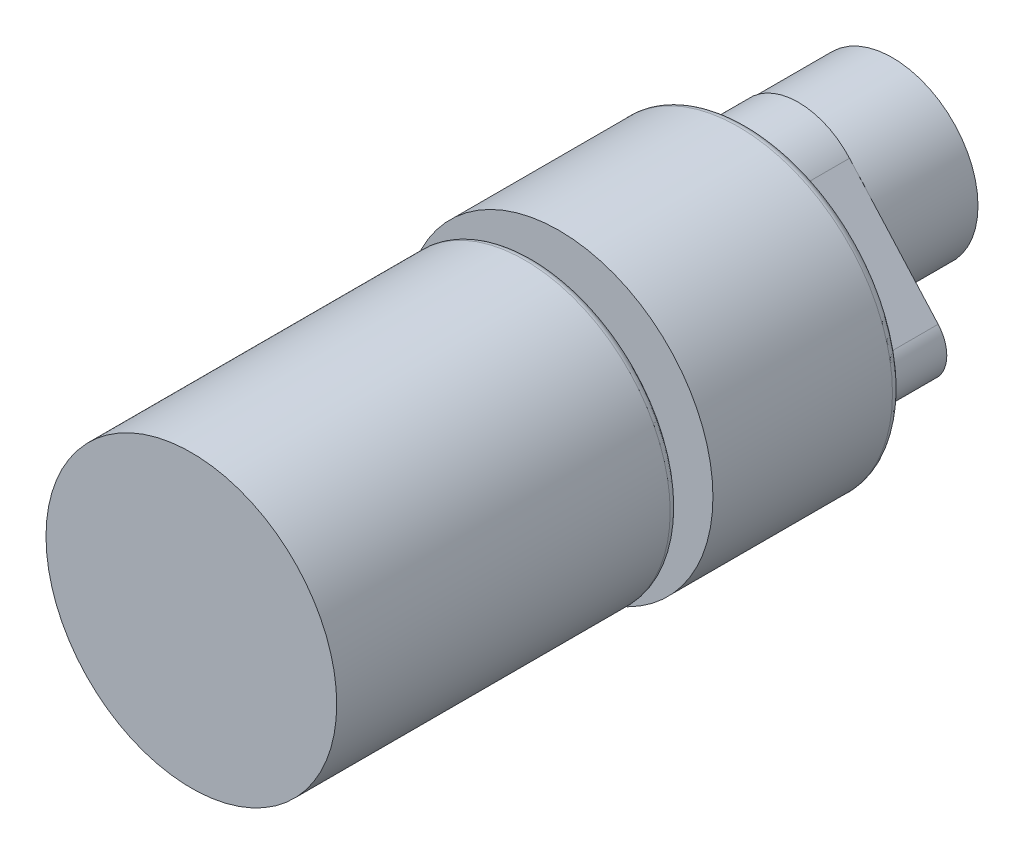
ISO-10303-21;
HEADER;
FILE_DESCRIPTION(('STEP AP214'),'2;1');
FILE_NAME('part.step','',(''),(''),'','','');
FILE_SCHEMA(('AUTOMOTIVE_DESIGN { 1 0 10303 214 1 1 1 1 }'));
ENDSEC;
DATA;
#1=APPLICATION_CONTEXT('core data for automotive mechanical design processes');
#2=APPLICATION_PROTOCOL_DEFINITION('international standard','automotive_design',2000,#1);
#3=PRODUCT_CONTEXT('',#1,'mechanical');
#4=PRODUCT('Part','Part','',(#3));
#5=PRODUCT_RELATED_PRODUCT_CATEGORY('part','',(#4));
#6=PRODUCT_DEFINITION_FORMATION('','',#4);
#7=PRODUCT_DEFINITION_CONTEXT('part definition',#1,'design');
#8=PRODUCT_DEFINITION('design','',#6,#7);
#9=PRODUCT_DEFINITION_SHAPE('','',#8);
#10=(LENGTH_UNIT() NAMED_UNIT(*) SI_UNIT(.MILLI.,.METRE.));
#11=(NAMED_UNIT(*) PLANE_ANGLE_UNIT() SI_UNIT($,.RADIAN.));
#12=(NAMED_UNIT(*) SI_UNIT($,.STERADIAN.) SOLID_ANGLE_UNIT());
#13=UNCERTAINTY_MEASURE_WITH_UNIT(LENGTH_MEASURE(1.E-05),#10,'distance_accuracy_value','');
#14=(GEOMETRIC_REPRESENTATION_CONTEXT(3) GLOBAL_UNCERTAINTY_ASSIGNED_CONTEXT((#13)) GLOBAL_UNIT_ASSIGNED_CONTEXT((#10,
#11,#12)) REPRESENTATION_CONTEXT('',''));
#15=CARTESIAN_POINT('',(0.,0.,0.));
#16=DIRECTION('',(0.,0.,1.));
#17=DIRECTION('',(1.,0.,0.));
#18=AXIS2_PLACEMENT_3D('',#15,#16,#17);
#19=CARTESIAN_POINT('',(0.,8.97293725574376,-71.));
#20=DIRECTION('',(0.,0.,-1.));
#21=DIRECTION('',(1.,0.,0.));
#22=AXIS2_PLACEMENT_3D('',#19,#20,#21);
#23=PLANE('',#22);
#24=CARTESIAN_POINT('',(0.,6.,-71.));
#25=DIRECTION('',(0.,0.,1.));
#26=DIRECTION('',(1.,0.,0.));
#27=AXIS2_PLACEMENT_3D('',#24,#25,#26);
#28=CIRCLE('',#27,10.);
#29=CARTESIAN_POINT('',(7.0041768547025,13.1373318956071,-71.));
#30=VERTEX_POINT('',#29);
#31=CARTESIAN_POINT('',(-7.0041768547025,13.1373318956071,-71.));
#32=VERTEX_POINT('',#31);
#33=EDGE_CURVE('E11',#30,#32,#28,.T.);
#34=ORIENTED_EDGE('',*,*,#33,.T.);
#35=DIRECTION('',(-0.665166563949336,-0.746695012842481,0.));
#36=VECTOR('',#35,1.);
#37=CARTESIAN_POINT('',(-5.97356010273985,14.2942697673385,-71.));
#38=LINE('',#37,#36);
#39=CARTESIAN_POINT('',(-5.97356010273985,14.2942697673385,-71.));
#40=VERTEX_POINT('',#39);
#41=EDGE_CURVE('E152',#40,#32,#38,.T.);
#42=ORIENTED_EDGE('',*,*,#41,.F.);
#43=CARTESIAN_POINT('',(0.,8.97293725574376,-71.));
#44=DIRECTION('',(0.,0.,1.));
#45=DIRECTION('',(1.,0.,0.));
#46=AXIS2_PLACEMENT_3D('',#43,#44,#45);
#47=CIRCLE('',#46,8.);
#48=CARTESIAN_POINT('',(5.97356010273985,14.2942697673385,-71.));
#49=VERTEX_POINT('',#48);
#50=EDGE_CURVE('E157',#49,#40,#47,.T.);
#51=ORIENTED_EDGE('',*,*,#50,.F.);
#52=DIRECTION('',(-0.665166563949337,0.746695012842481,0.));
#53=VECTOR('',#52,1.);
#54=CARTESIAN_POINT('',(16.3369399847924,2.66066625579735,-71.));
#55=LINE('',#54,#53);
#56=EDGE_CURVE('E132',#30,#49,#55,.T.);
#57=ORIENTED_EDGE('',*,*,#56,.F.);
#58=EDGE_LOOP('',(#34,#42,#51,#57));
#59=FACE_BOUND('',#58,.T.);
#60=ADVANCED_FACE('F35',(#59),#23,.T.);
#61=CARTESIAN_POINT('',(-7.89611982561368,12.1360648382779,-71.));
#62=VERTEX_POINT('',#61);
#63=CARTESIAN_POINT('',(0.,-4.,-71.));
#64=VERTEX_POINT('',#63);
#65=EDGE_CURVE('E44',#62,#64,#28,.T.);
#66=ORIENTED_EDGE('',*,*,#65,.T.);
#67=DIRECTION('',(1.,0.,0.));
#68=VECTOR('',#67,1.);
#69=CARTESIAN_POINT('',(-13.3501599334225,-4.,-71.));
#70=LINE('',#69,#68);
#71=CARTESIAN_POINT('',(-13.3501599334225,-4.,-71.));
#72=VERTEX_POINT('',#71);
#73=EDGE_CURVE('E144',#72,#64,#70,.T.);
#74=ORIENTED_EDGE('',*,*,#73,.F.);
#75=CARTESIAN_POINT('',(-13.3501599334225,0.,-71.));
#76=DIRECTION('',(0.,0.,1.));
#77=DIRECTION('',(-1.,0.,0.));
#78=AXIS2_PLACEMENT_3D('',#75,#76,#77);
#79=CIRCLE('',#78,4.);
#80=CARTESIAN_POINT('',(-16.3369399847924,2.66066625579734,-71.));
#81=VERTEX_POINT('',#80);
#82=EDGE_CURVE('E149',#81,#72,#79,.T.);
#83=ORIENTED_EDGE('',*,*,#82,.F.);
#84=EDGE_CURVE('E156',#62,#81,#38,.T.);
#85=ORIENTED_EDGE('',*,*,#84,.F.);
#86=EDGE_LOOP('',(#66,#74,#83,#85));
#87=FACE_BOUND('',#86,.T.);
#88=ADVANCED_FACE('F249',(#87),#23,.T.);
#89=CARTESIAN_POINT('',(0.,0.,-65.));
#90=DIRECTION('',(0.,0.,-1.));
#91=DIRECTION('',(1.,0.,0.));
#92=AXIS2_PLACEMENT_3D('',#89,#90,#91);
#93=PLANE('',#92);
#94=DIRECTION('',(1.,0.,0.));
#95=VECTOR('',#94,1.);
#96=CARTESIAN_POINT('',(-13.3501599334225,-4.,-65.));
#97=LINE('',#96,#95);
#98=CARTESIAN_POINT('',(-13.3501599334225,-4.,-65.));
#99=VERTEX_POINT('',#98);
#100=CARTESIAN_POINT('',(13.3501599334225,-4.,-65.));
#101=VERTEX_POINT('',#100);
#102=EDGE_CURVE('E177',#99,#101,#97,.T.);
#103=ORIENTED_EDGE('',*,*,#102,.T.);
#104=CARTESIAN_POINT('',(13.3501599334225,0.,-65.));
#105=DIRECTION('',(0.,0.,1.));
#106=DIRECTION('',(1.,0.,0.));
#107=AXIS2_PLACEMENT_3D('',#104,#105,#106);
#108=CIRCLE('',#107,4.);
#109=CARTESIAN_POINT('',(16.8996765768439,-1.84416148915284,-65.));
#110=VERTEX_POINT('',#109);
#111=EDGE_CURVE('E182',#101,#110,#108,.T.);
#112=ORIENTED_EDGE('',*,*,#111,.T.);
#113=CARTESIAN_POINT('',(0.,0.,-65.));
#114=DIRECTION('',(0.,0.,1.));
#115=DIRECTION('',(1.,0.,0.));
#116=AXIS2_PLACEMENT_3D('',#113,#114,#115);
#117=CIRCLE('',#116,17.);
#118=CARTESIAN_POINT('',(-16.8996765768439,-1.84416148915284,-65.));
#119=VERTEX_POINT('',#118);
#120=EDGE_CURVE('E222',#119,#110,#117,.T.);
#121=ORIENTED_EDGE('',*,*,#120,.F.);
#122=CARTESIAN_POINT('',(-13.3501599334225,0.,-65.));
#123=DIRECTION('',(0.,0.,1.));
#124=DIRECTION('',(-1.,0.,0.));
#125=AXIS2_PLACEMENT_3D('',#122,#123,#124);
#126=CIRCLE('',#125,4.);
#127=EDGE_CURVE('E171',#119,#99,#126,.T.);
#128=ORIENTED_EDGE('',*,*,#127,.T.);
#129=EDGE_LOOP('',(#103,#112,#121,#128));
#130=FACE_BOUND('',#129,.T.);
#131=ADVANCED_FACE('F232',(#130),#93,.T.);
#132=CARTESIAN_POINT('',(16.8996765768439,1.84416148915285,-65.));
#133=VERTEX_POINT('',#132);
#134=CARTESIAN_POINT('',(-16.8996765768439,1.84416148915284,-65.));
#135=VERTEX_POINT('',#134);
#136=EDGE_CURVE('E214',#133,#135,#117,.T.);
#137=ORIENTED_EDGE('',*,*,#136,.F.);
#138=CARTESIAN_POINT('',(16.3369399847924,2.66066625579735,-65.));
#139=VERTEX_POINT('',#138);
#140=EDGE_CURVE('E181',#133,#139,#108,.T.);
#141=ORIENTED_EDGE('',*,*,#140,.T.);
#142=DIRECTION('',(-0.665166563949337,0.746695012842481,0.));
#143=VECTOR('',#142,1.);
#144=CARTESIAN_POINT('',(16.3369399847924,2.66066625579735,-65.));
#145=LINE('',#144,#143);
#146=CARTESIAN_POINT('',(5.97356010273985,14.2942697673385,-65.));
#147=VERTEX_POINT('',#146);
#148=EDGE_CURVE('E159',#139,#147,#145,.T.);
#149=ORIENTED_EDGE('',*,*,#148,.T.);
#150=CARTESIAN_POINT('',(0.,8.97293725574376,-65.));
#151=DIRECTION('',(0.,0.,1.));
#152=DIRECTION('',(1.,0.,0.));
#153=AXIS2_PLACEMENT_3D('',#150,#151,#152);
#154=CIRCLE('',#153,8.);
#155=CARTESIAN_POINT('',(-5.97356010273985,14.2942697673385,-65.));
#156=VERTEX_POINT('',#155);
#157=EDGE_CURVE('E162',#147,#156,#154,.T.);
#158=ORIENTED_EDGE('',*,*,#157,.T.);
#159=DIRECTION('',(-0.665166563949336,-0.746695012842481,0.));
#160=VECTOR('',#159,1.);
#161=CARTESIAN_POINT('',(-5.97356010273985,14.2942697673385,-65.));
#162=LINE('',#161,#160);
#163=CARTESIAN_POINT('',(-16.3369399847924,2.66066625579734,-65.));
#164=VERTEX_POINT('',#163);
#165=EDGE_CURVE('E166',#156,#164,#162,.T.);
#166=ORIENTED_EDGE('',*,*,#165,.T.);
#167=EDGE_CURVE('E174',#164,#135,#126,.T.);
#168=ORIENTED_EDGE('',*,*,#167,.T.);
#169=EDGE_LOOP('',(#137,#141,#149,#158,#166,#168));
#170=FACE_BOUND('',#169,.T.);
#171=ADVANCED_FACE('F428',(#170),#93,.T.);
#172=CARTESIAN_POINT('',(0.,0.,-40.));
#173=DIRECTION('',(0.,0.,1.));
#174=DIRECTION('',(-1.,0.,0.));
#175=AXIS2_PLACEMENT_3D('',#172,#173,#174);
#176=CYLINDRICAL_SURFACE('',#175,17.);
#177=CARTESIAN_POINT('',(0.,0.,-39.));
#178=DIRECTION('',(0.,0.,1.));
#179=DIRECTION('',(1.,0.,0.));
#180=AXIS2_PLACEMENT_3D('',#177,#178,#179);
#181=CIRCLE('',#180,17.);
#182=CARTESIAN_POINT('',(17.,0.,-39.));
#183=VERTEX_POINT('',#182);
#184=EDGE_CURVE('E211',#183,#183,#181,.F.);
#185=ORIENTED_EDGE('',*,*,#184,.F.);
#186=EDGE_LOOP('',(#185));
#187=FACE_BOUND('',#186,.T.);
#188=CARTESIAN_POINT('',(0.,0.,0.));
#189=DIRECTION('',(0.,0.,1.));
#190=DIRECTION('',(1.,0.,0.));
#191=AXIS2_PLACEMENT_3D('',#188,#189,#190);
#192=CIRCLE('',#191,17.);
#193=CARTESIAN_POINT('',(17.,0.,0.));
#194=VERTEX_POINT('',#193);
#195=EDGE_CURVE('E203',#194,#194,#192,.T.);
#196=ORIENTED_EDGE('',*,*,#195,.F.);
#197=EDGE_LOOP('',(#196));
#198=FACE_BOUND('',#197,.T.);
#199=ADVANCED_FACE('F418',(#187,#198),#176,.T.);
#200=CARTESIAN_POINT('',(0.,0.,-40.));
#201=DIRECTION('',(0.,0.,-1.));
#202=DIRECTION('',(1.,0.,0.));
#203=AXIS2_PLACEMENT_3D('',#200,#201,#202);
#204=PLANE('',#203);
#205=CARTESIAN_POINT('',(0.,0.,-40.));
#206=DIRECTION('',(0.,0.,1.));
#207=DIRECTION('',(1.,0.,0.));
#208=AXIS2_PLACEMENT_3D('',#205,#206,#207);
#209=CIRCLE('',#208,16.);
#210=CARTESIAN_POINT('',(16.,0.,-40.));
#211=VERTEX_POINT('',#210);
#212=EDGE_CURVE('E208',#211,#211,#209,.T.);
#213=ORIENTED_EDGE('',*,*,#212,.F.);
#214=EDGE_LOOP('',(#213));
#215=FACE_BOUND('',#214,.T.);
#216=CARTESIAN_POINT('',(0.,0.,-40.));
#217=DIRECTION('',(0.,0.,1.));
#218=DIRECTION('',(1.,0.,0.));
#219=AXIS2_PLACEMENT_3D('',#216,#217,#218);
#220=CIRCLE('',#219,5.);
#221=CARTESIAN_POINT('',(5.,0.,-40.));
#222=VERTEX_POINT('',#221);
#223=EDGE_CURVE('E199',#222,#222,#220,.T.);
#224=ORIENTED_EDGE('',*,*,#223,.T.);
#225=EDGE_LOOP('',(#224));
#226=FACE_BOUND('',#225,.T.);
#227=ADVANCED_FACE('F408',(#215,#226),#204,.T.);
#228=CARTESIAN_POINT('',(0.,0.,0.));
#229=DIRECTION('',(0.,0.,-1.));
#230=DIRECTION('',(1.,0.,0.));
#231=AXIS2_PLACEMENT_3D('',#228,#229,#230);
#232=PLANE('',#231);
#233=ORIENTED_EDGE('',*,*,#195,.T.);
#234=EDGE_LOOP('',(#233));
#235=FACE_BOUND('',#234,.T.);
#236=ADVANCED_FACE('F398',(#235),#232,.F.);
#237=CARTESIAN_POINT('',(0.,0.,-43.));
#238=DIRECTION('',(0.,0.,1.));
#239=DIRECTION('',(-1.,0.,0.));
#240=AXIS2_PLACEMENT_3D('',#237,#238,#239);
#241=CYLINDRICAL_SURFACE('',#240,5.);
#242=CARTESIAN_POINT('',(0.,0.,-43.));
#243=DIRECTION('',(0.,0.,1.));
#244=DIRECTION('',(1.,0.,0.));
#245=AXIS2_PLACEMENT_3D('',#242,#243,#244);
#246=CIRCLE('',#245,5.);
#247=CARTESIAN_POINT('',(5.,0.,-43.));
#248=VERTEX_POINT('',#247);
#249=EDGE_CURVE('E200',#248,#248,#246,.T.);
#250=ORIENTED_EDGE('',*,*,#249,.T.);
#251=EDGE_LOOP('',(#250));
#252=FACE_BOUND('',#251,.T.);
#253=ORIENTED_EDGE('',*,*,#223,.F.);
#254=EDGE_LOOP('',(#253));
#255=FACE_BOUND('',#254,.T.);
#256=ADVANCED_FACE('F389',(#252,#255),#241,.T.);
#257=CARTESIAN_POINT('',(0.,0.,-39.));
#258=DIRECTION('',(0.,0.,-1.));
#259=DIRECTION('',(1.,0.,0.));
#260=AXIS2_PLACEMENT_3D('',#257,#258,#259);
#261=TOROIDAL_SURFACE('',#260,16.,1.);
#262=ORIENTED_EDGE('',*,*,#184,.T.);
#263=EDGE_LOOP('',(#262));
#264=FACE_BOUND('',#263,.T.);
#265=ORIENTED_EDGE('',*,*,#212,.T.);
#266=EDGE_LOOP('',(#265));
#267=FACE_BOUND('',#266,.T.);
#268=ADVANCED_FACE('F379',(#264,#267),#261,.T.);
#269=CARTESIAN_POINT('',(0.,0.,-65.));
#270=DIRECTION('',(0.,0.,1.));
#271=DIRECTION('',(-1.,0.,0.));
#272=AXIS2_PLACEMENT_3D('',#269,#270,#271);
#273=CYLINDRICAL_SURFACE('',#272,18.);
#274=CARTESIAN_POINT('',(0.,0.,-64.));
#275=DIRECTION('',(0.,0.,1.));
#276=DIRECTION('',(1.,0.,0.));
#277=AXIS2_PLACEMENT_3D('',#274,#275,#276);
#278=CIRCLE('',#277,18.);
#279=CARTESIAN_POINT('',(18.,0.,-64.));
#280=VERTEX_POINT('',#279);
#281=EDGE_CURVE('E39',#280,#280,#278,.F.);
#282=ORIENTED_EDGE('',*,*,#281,.F.);
#283=EDGE_LOOP('',(#282));
#284=FACE_BOUND('',#283,.T.);
#285=CARTESIAN_POINT('',(0.,0.,-43.));
#286=DIRECTION('',(0.,0.,1.));
#287=DIRECTION('',(1.,0.,0.));
#288=AXIS2_PLACEMENT_3D('',#285,#286,#287);
#289=CIRCLE('',#288,18.);
#290=CARTESIAN_POINT('',(18.,0.,-43.));
#291=VERTEX_POINT('',#290);
#292=EDGE_CURVE('E196',#291,#291,#289,.T.);
#293=ORIENTED_EDGE('',*,*,#292,.F.);
#294=EDGE_LOOP('',(#293));
#295=FACE_BOUND('',#294,.T.);
#296=ADVANCED_FACE('F369',(#284,#295),#273,.T.);
#297=CARTESIAN_POINT('',(0.,0.,-43.));
#298=DIRECTION('',(0.,0.,-1.));
#299=DIRECTION('',(1.,0.,0.));
#300=AXIS2_PLACEMENT_3D('',#297,#298,#299);
#301=PLANE('',#300);
#302=ORIENTED_EDGE('',*,*,#249,.F.);
#303=EDGE_LOOP('',(#302));
#304=FACE_BOUND('',#303,.T.);
#305=ORIENTED_EDGE('',*,*,#292,.T.);
#306=EDGE_LOOP('',(#305));
#307=FACE_BOUND('',#306,.T.);
#308=ADVANCED_FACE('F360',(#304,#307),#301,.F.);
#309=CARTESIAN_POINT('',(0.,0.,-64.));
#310=DIRECTION('',(0.,0.,-1.));
#311=DIRECTION('',(1.,0.,0.));
#312=AXIS2_PLACEMENT_3D('',#309,#310,#311);
#313=TOROIDAL_SURFACE('',#312,17.,1.);
#314=ORIENTED_EDGE('',*,*,#281,.T.);
#315=EDGE_LOOP('',(#314));
#316=FACE_BOUND('',#315,.T.);
#317=ORIENTED_EDGE('',*,*,#136,.T.);
#318=EDGE_CURVE('E216',#135,#119,#117,.T.);
#319=ORIENTED_EDGE('',*,*,#318,.T.);
#320=ORIENTED_EDGE('',*,*,#120,.T.);
#321=EDGE_CURVE('E213',#110,#133,#117,.T.);
#322=ORIENTED_EDGE('',*,*,#321,.T.);
#323=EDGE_LOOP('',(#317,#319,#320,#322));
#324=FACE_BOUND('',#323,.T.);
#325=ADVANCED_FACE('F37',(#316,#324),#313,.T.);
#326=CARTESIAN_POINT('',(0.,8.97293725574376,-65.));
#327=DIRECTION('',(0.,0.,-1.));
#328=DIRECTION('',(1.,0.,0.));
#329=AXIS2_PLACEMENT_3D('',#326,#327,#328);
#330=PLANE('',#329);
#331=ORIENTED_EDGE('',*,*,#318,.F.);
#332=EDGE_CURVE('E178',#135,#119,#126,.T.);
#333=ORIENTED_EDGE('',*,*,#332,.T.);
#334=EDGE_LOOP('',(#331,#333));
#335=FACE_BOUND('',#334,.T.);
#336=ADVANCED_FACE('F241',(#335),#330,.F.);
#337=CARTESIAN_POINT('',(0.,8.97293725574376,-71.));
#338=DIRECTION('',(0.,0.,1.));
#339=DIRECTION('',(-1.,0.,0.));
#340=AXIS2_PLACEMENT_3D('',#337,#338,#339);
#341=CYLINDRICAL_SURFACE('',#340,8.);
#342=ORIENTED_EDGE('',*,*,#157,.F.);
#343=DIRECTION('',(0.,0.,1.));
#344=VECTOR('',#343,1.);
#345=CARTESIAN_POINT('',(5.97356010273985,14.2942697673385,-71.));
#346=LINE('',#345,#344);
#347=EDGE_CURVE('E138',#49,#147,#346,.T.);
#348=ORIENTED_EDGE('',*,*,#347,.F.);
#349=ORIENTED_EDGE('',*,*,#50,.T.);
#350=DIRECTION('',(0.,0.,1.));
#351=VECTOR('',#350,1.);
#352=CARTESIAN_POINT('',(-5.97356010273985,14.2942697673385,-71.));
#353=LINE('',#352,#351);
#354=EDGE_CURVE('E194',#40,#156,#353,.T.);
#355=ORIENTED_EDGE('',*,*,#354,.T.);
#356=EDGE_LOOP('',(#342,#348,#349,#355));
#357=FACE_BOUND('',#356,.T.);
#358=ADVANCED_FACE('F252',(#357),#341,.T.);
#359=CARTESIAN_POINT('',(-5.97356010273985,14.2942697673385,-71.));
#360=DIRECTION('',(0.746695012842481,-0.665166563949336,0.));
#361=DIRECTION('',(0.665166563949336,0.746695012842481,0.));
#362=AXIS2_PLACEMENT_3D('',#359,#360,#361);
#363=PLANE('',#362);
#364=ORIENTED_EDGE('',*,*,#165,.F.);
#365=ORIENTED_EDGE('',*,*,#354,.F.);
#366=ORIENTED_EDGE('',*,*,#41,.T.);
#367=EDGE_CURVE('E155',#32,#62,#38,.T.);
#368=ORIENTED_EDGE('',*,*,#367,.T.);
#369=ORIENTED_EDGE('',*,*,#84,.T.);
#370=DIRECTION('',(0.,0.,1.));
#371=VECTOR('',#370,1.);
#372=CARTESIAN_POINT('',(-16.3369399847924,2.66066625579734,-71.));
#373=LINE('',#372,#371);
#374=EDGE_CURVE('E192',#81,#164,#373,.T.);
#375=ORIENTED_EDGE('',*,*,#374,.T.);
#376=EDGE_LOOP('',(#364,#365,#366,#368,#369,#375));
#377=FACE_BOUND('',#376,.T.);
#378=ADVANCED_FACE('F326',(#377),#363,.F.);
#379=CARTESIAN_POINT('',(-13.3501599334225,0.,-71.));
#380=DIRECTION('',(0.,0.,1.));
#381=DIRECTION('',(-1.,0.,0.));
#382=AXIS2_PLACEMENT_3D('',#379,#380,#381);
#383=CYLINDRICAL_SURFACE('',#382,4.);
#384=ORIENTED_EDGE('',*,*,#167,.F.);
#385=ORIENTED_EDGE('',*,*,#374,.F.);
#386=ORIENTED_EDGE('',*,*,#82,.T.);
#387=DIRECTION('',(0.,0.,1.));
#388=VECTOR('',#387,1.);
#389=CARTESIAN_POINT('',(-13.3501599334225,-4.,-71.));
#390=LINE('',#389,#388);
#391=EDGE_CURVE('E190',#72,#99,#390,.T.);
#392=ORIENTED_EDGE('',*,*,#391,.T.);
#393=ORIENTED_EDGE('',*,*,#127,.F.);
#394=ORIENTED_EDGE('',*,*,#332,.F.);
#395=EDGE_LOOP('',(#384,#385,#386,#392,#393,#394));
#396=FACE_BOUND('',#395,.T.);
#397=ADVANCED_FACE('F316',(#396),#383,.T.);
#398=CARTESIAN_POINT('',(-13.3501599334225,-4.,-71.));
#399=DIRECTION('',(0.,1.,0.));
#400=DIRECTION('',(0.,0.,-1.));
#401=AXIS2_PLACEMENT_3D('',#398,#399,#400);
#402=PLANE('',#401);
#403=ORIENTED_EDGE('',*,*,#102,.F.);
#404=ORIENTED_EDGE('',*,*,#391,.F.);
#405=ORIENTED_EDGE('',*,*,#73,.T.);
#406=CARTESIAN_POINT('',(13.3501599334225,-4.,-71.));
#407=VERTEX_POINT('',#406);
#408=EDGE_CURVE('E125',#64,#407,#70,.T.);
#409=ORIENTED_EDGE('',*,*,#408,.T.);
#410=DIRECTION('',(0.,0.,1.));
#411=VECTOR('',#410,1.);
#412=CARTESIAN_POINT('',(13.3501599334225,-4.,-71.));
#413=LINE('',#412,#411);
#414=EDGE_CURVE('E188',#407,#101,#413,.T.);
#415=ORIENTED_EDGE('',*,*,#414,.T.);
#416=EDGE_LOOP('',(#403,#404,#405,#409,#415));
#417=FACE_BOUND('',#416,.T.);
#418=ADVANCED_FACE('F307',(#417),#402,.F.);
#419=CARTESIAN_POINT('',(13.3501599334225,0.,-71.));
#420=DIRECTION('',(0.,0.,1.));
#421=DIRECTION('',(-1.,0.,0.));
#422=AXIS2_PLACEMENT_3D('',#419,#420,#421);
#423=CYLINDRICAL_SURFACE('',#422,4.);
#424=ORIENTED_EDGE('',*,*,#111,.F.);
#425=ORIENTED_EDGE('',*,*,#414,.F.);
#426=CARTESIAN_POINT('',(13.3501599334225,0.,-71.));
#427=DIRECTION('',(0.,0.,1.));
#428=DIRECTION('',(1.,0.,0.));
#429=AXIS2_PLACEMENT_3D('',#426,#427,#428);
#430=CIRCLE('',#429,4.);
#431=CARTESIAN_POINT('',(16.3369399847924,2.66066625579735,-71.));
#432=VERTEX_POINT('',#431);
#433=EDGE_CURVE('E142',#407,#432,#430,.T.);
#434=ORIENTED_EDGE('',*,*,#433,.T.);
#435=DIRECTION('',(0.,0.,1.));
#436=VECTOR('',#435,1.);
#437=CARTESIAN_POINT('',(16.3369399847924,2.66066625579735,-71.));
#438=LINE('',#437,#436);
#439=EDGE_CURVE('E136',#432,#139,#438,.T.);
#440=ORIENTED_EDGE('',*,*,#439,.T.);
#441=ORIENTED_EDGE('',*,*,#140,.F.);
#442=EDGE_CURVE('E185',#110,#133,#108,.T.);
#443=ORIENTED_EDGE('',*,*,#442,.F.);
#444=EDGE_LOOP('',(#424,#425,#434,#440,#441,#443));
#445=FACE_BOUND('',#444,.T.);
#446=ADVANCED_FACE('F234',(#445),#423,.T.);
#447=CARTESIAN_POINT('',(16.3369399847924,2.66066625579735,-71.));
#448=DIRECTION('',(-0.746695012842481,-0.665166563949336,0.));
#449=DIRECTION('',(0.665166563949336,-0.746695012842481,0.));
#450=AXIS2_PLACEMENT_3D('',#447,#448,#449);
#451=PLANE('',#450);
#452=ORIENTED_EDGE('',*,*,#148,.F.);
#453=ORIENTED_EDGE('',*,*,#439,.F.);
#454=CARTESIAN_POINT('',(7.89611982561368,12.1360648382779,-71.));
#455=VERTEX_POINT('',#454);
#456=EDGE_CURVE('E122',#432,#455,#55,.T.);
#457=ORIENTED_EDGE('',*,*,#456,.T.);
#458=EDGE_CURVE('E127',#455,#30,#55,.T.);
#459=ORIENTED_EDGE('',*,*,#458,.T.);
#460=ORIENTED_EDGE('',*,*,#56,.T.);
#461=ORIENTED_EDGE('',*,*,#347,.T.);
#462=EDGE_LOOP('',(#452,#453,#457,#459,#460,#461));
#463=FACE_BOUND('',#462,.T.);
#464=ADVANCED_FACE('F135',(#463),#451,.F.);
#465=EDGE_CURVE('E59',#64,#455,#28,.T.);
#466=ORIENTED_EDGE('',*,*,#465,.T.);
#467=ORIENTED_EDGE('',*,*,#456,.F.);
#468=ORIENTED_EDGE('',*,*,#433,.F.);
#469=ORIENTED_EDGE('',*,*,#408,.F.);
#470=EDGE_LOOP('',(#466,#467,#468,#469));
#471=FACE_BOUND('',#470,.T.);
#472=ADVANCED_FACE('F120',(#471),#23,.T.);
#473=ORIENTED_EDGE('',*,*,#321,.F.);
#474=ORIENTED_EDGE('',*,*,#442,.T.);
#475=EDGE_LOOP('',(#473,#474));
#476=FACE_BOUND('',#475,.T.);
#477=ADVANCED_FACE('F237',(#476),#330,.F.);
#478=CARTESIAN_POINT('',(0.,6.,-71.));
#479=DIRECTION('',(0.,0.,-1.));
#480=DIRECTION('',(1.,0.,0.));
#481=AXIS2_PLACEMENT_3D('',#478,#479,#480);
#482=PLANE('',#481);
#483=EDGE_CURVE('E46',#32,#62,#28,.T.);
#484=ORIENTED_EDGE('',*,*,#483,.T.);
#485=ORIENTED_EDGE('',*,*,#367,.F.);
#486=EDGE_LOOP('',(#484,#485));
#487=FACE_BOUND('',#486,.T.);
#488=ADVANCED_FACE('F239',(#487),#482,.F.);
#489=EDGE_CURVE('E52',#455,#30,#28,.T.);
#490=ORIENTED_EDGE('',*,*,#489,.T.);
#491=ORIENTED_EDGE('',*,*,#458,.F.);
#492=EDGE_LOOP('',(#490,#491));
#493=FACE_BOUND('',#492,.T.);
#494=ADVANCED_FACE('F128',(#493),#482,.F.);
#495=CARTESIAN_POINT('',(0.,6.,-82.));
#496=DIRECTION('',(0.,0.,1.));
#497=DIRECTION('',(-1.,0.,0.));
#498=AXIS2_PLACEMENT_3D('',#495,#496,#497);
#499=CYLINDRICAL_SURFACE('',#498,10.);
#500=CARTESIAN_POINT('',(0.,6.,-82.));
#501=DIRECTION('',(0.,0.,1.));
#502=DIRECTION('',(1.,0.,0.));
#503=AXIS2_PLACEMENT_3D('',#500,#501,#502);
#504=CIRCLE('',#503,10.);
#505=CARTESIAN_POINT('',(10.,6.,-82.));
#506=VERTEX_POINT('',#505);
#507=EDGE_CURVE('E118',#506,#506,#504,.T.);
#508=ORIENTED_EDGE('',*,*,#507,.T.);
#509=EDGE_LOOP('',(#508));
#510=FACE_BOUND('',#509,.T.);
#511=ORIENTED_EDGE('',*,*,#489,.F.);
#512=ORIENTED_EDGE('',*,*,#465,.F.);
#513=ORIENTED_EDGE('',*,*,#65,.F.);
#514=ORIENTED_EDGE('',*,*,#483,.F.);
#515=ORIENTED_EDGE('',*,*,#33,.F.);
#516=EDGE_LOOP('',(#511,#512,#513,#514,#515));
#517=FACE_BOUND('',#516,.T.);
#518=ADVANCED_FACE('F117',(#510,#517),#499,.T.);
#519=CARTESIAN_POINT('',(0.,6.,-82.));
#520=DIRECTION('',(0.,0.,-1.));
#521=DIRECTION('',(1.,0.,0.));
#522=AXIS2_PLACEMENT_3D('',#519,#520,#521);
#523=PLANE('',#522);
#524=ORIENTED_EDGE('',*,*,#507,.F.);
#525=EDGE_LOOP('',(#524));
#526=FACE_BOUND('',#525,.T.);
#527=ADVANCED_FACE('F262',(#526),#523,.T.);
#528=CLOSED_SHELL('',(#60,#88,#131,#171,#199,#227,#236,#256,#268,#296,#308,#325,#336,#358,#378,
#397,#418,#446,#464,#472,#477,#488,#494,#518,#527));
#529=MANIFOLD_SOLID_BREP('B2',#528);
#530=ADVANCED_BREP_SHAPE_REPRESENTATION('',(#18,#529),#14);
#531=SHAPE_DEFINITION_REPRESENTATION(#9,#530);
ENDSEC;
END-ISO-10303-21;
